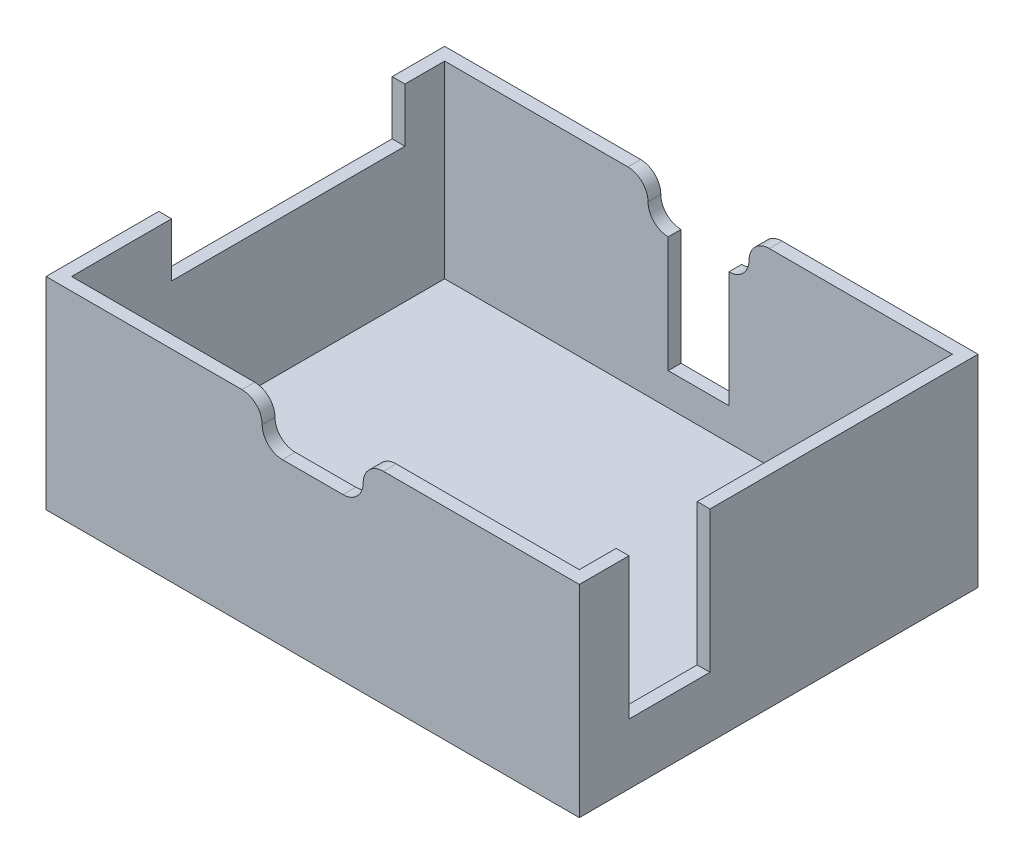
ISO-10303-21;
HEADER;
FILE_DESCRIPTION(('STEP AP214'),'2;1');
FILE_NAME('part.step','',(''),(''),'','','');
FILE_SCHEMA(('AUTOMOTIVE_DESIGN { 1 0 10303 214 1 1 1 1 }'));
ENDSEC;
DATA;
#1=APPLICATION_CONTEXT('core data for automotive mechanical design processes');
#2=APPLICATION_PROTOCOL_DEFINITION('international standard','automotive_design',2000,#1);
#3=PRODUCT_CONTEXT('',#1,'mechanical');
#4=PRODUCT('Part','Part','',(#3));
#5=PRODUCT_RELATED_PRODUCT_CATEGORY('part','',(#4));
#6=PRODUCT_DEFINITION_FORMATION('','',#4);
#7=PRODUCT_DEFINITION_CONTEXT('part definition',#1,'design');
#8=PRODUCT_DEFINITION('design','',#6,#7);
#9=PRODUCT_DEFINITION_SHAPE('','',#8);
#10=(LENGTH_UNIT() NAMED_UNIT(*) SI_UNIT(.MILLI.,.METRE.));
#11=(NAMED_UNIT(*) PLANE_ANGLE_UNIT() SI_UNIT($,.RADIAN.));
#12=(NAMED_UNIT(*) SI_UNIT($,.STERADIAN.) SOLID_ANGLE_UNIT());
#13=UNCERTAINTY_MEASURE_WITH_UNIT(LENGTH_MEASURE(1.E-05),#10,'distance_accuracy_value','');
#14=(GEOMETRIC_REPRESENTATION_CONTEXT(3) GLOBAL_UNCERTAINTY_ASSIGNED_CONTEXT((#13)) GLOBAL_UNIT_ASSIGNED_CONTEXT((#10,
#11,#12)) REPRESENTATION_CONTEXT('',''));
#15=CARTESIAN_POINT('',(0.,0.,0.));
#16=DIRECTION('',(0.,0.,1.));
#17=DIRECTION('',(1.,0.,0.));
#18=AXIS2_PLACEMENT_3D('',#15,#16,#17);
#19=CARTESIAN_POINT('',(0.,38.1,0.));
#20=DIRECTION('',(0.,1.,0.));
#21=DIRECTION('',(0.,0.,1.));
#22=AXIS2_PLACEMENT_3D('',#19,#20,#21);
#23=PLANE('',#22);
#24=DIRECTION('',(0.,0.,-1.));
#25=VECTOR('',#24,1.);
#26=CARTESIAN_POINT('',(100.584,38.1,-75.184));
#27=LINE('',#26,#25);
#28=CARTESIAN_POINT('',(100.584,38.1,0.));
#29=VERTEX_POINT('',#28);
#30=CARTESIAN_POINT('',(100.584,38.1,-9.35933554843175));
#31=VERTEX_POINT('',#30);
#32=EDGE_CURVE('E339',#29,#31,#27,.T.);
#33=ORIENTED_EDGE('',*,*,#32,.T.);
#34=DIRECTION('',(-1.,0.,0.));
#35=VECTOR('',#34,1.);
#36=CARTESIAN_POINT('',(0.,38.1,-9.35933554843175));
#37=LINE('',#36,#35);
#38=CARTESIAN_POINT('',(98.171,38.1,-9.35933554843175));
#39=VERTEX_POINT('',#38);
#40=EDGE_CURVE('E332',#31,#39,#37,.T.);
#41=ORIENTED_EDGE('',*,*,#40,.T.);
#42=DIRECTION('',(0.,0.,-1.));
#43=VECTOR('',#42,1.);
#44=CARTESIAN_POINT('',(98.171,38.1,-72.771));
#45=LINE('',#44,#43);
#46=CARTESIAN_POINT('',(98.171,38.1,-2.41299999999998));
#47=VERTEX_POINT('',#46);
#48=EDGE_CURVE('E326',#47,#39,#45,.T.);
#49=ORIENTED_EDGE('',*,*,#48,.F.);
#50=DIRECTION('',(1.,0.,0.));
#51=VECTOR('',#50,1.);
#52=CARTESIAN_POINT('',(2.41299999999998,38.1,-2.41300000000001));
#53=LINE('',#52,#51);
#54=CARTESIAN_POINT('',(63.627,38.1,-2.41299999999999));
#55=VERTEX_POINT('',#54);
#56=EDGE_CURVE('E379',#55,#47,#53,.T.);
#57=ORIENTED_EDGE('',*,*,#56,.F.);
#58=DIRECTION('',(0.,0.,-1.));
#59=VECTOR('',#58,1.);
#60=CARTESIAN_POINT('',(63.627,38.1,0.));
#61=LINE('',#60,#59);
#62=CARTESIAN_POINT('',(63.627,38.1,0.));
#63=VERTEX_POINT('',#62);
#64=EDGE_CURVE('E492',#55,#63,#61,.F.);
#65=ORIENTED_EDGE('',*,*,#64,.T.);
#66=DIRECTION('',(1.,0.,0.));
#67=VECTOR('',#66,1.);
#68=CARTESIAN_POINT('',(0.,38.1,0.));
#69=LINE('',#68,#67);
#70=EDGE_CURVE('E426',#63,#29,#69,.T.);
#71=ORIENTED_EDGE('',*,*,#70,.T.);
#72=EDGE_LOOP('',(#33,#41,#49,#57,#65,#71));
#73=FACE_BOUND('',#72,.T.);
#74=ADVANCED_FACE('F42',(#73),#23,.T.);
#75=CARTESIAN_POINT('',(100.584,2.54,0.));
#76=DIRECTION('',(-1.,0.,0.));
#77=DIRECTION('',(0.,0.,1.));
#78=AXIS2_PLACEMENT_3D('',#75,#76,#77);
#79=PLANE('',#78);
#80=DIRECTION('',(0.,1.,0.));
#81=VECTOR('',#80,1.);
#82=CARTESIAN_POINT('',(100.584,11.430254,-9.35933554843175));
#83=LINE('',#82,#81);
#84=CARTESIAN_POINT('',(100.584,11.430254,-9.35933554843175));
#85=VERTEX_POINT('',#84);
#86=EDGE_CURVE('E611',#85,#31,#83,.T.);
#87=ORIENTED_EDGE('',*,*,#86,.T.);
#88=ORIENTED_EDGE('',*,*,#32,.F.);
#89=DIRECTION('',(0.,-1.,0.));
#90=VECTOR('',#89,1.);
#91=CARTESIAN_POINT('',(100.584,2.54,0.));
#92=LINE('',#91,#90);
#93=CARTESIAN_POINT('',(100.584,0.,0.));
#94=VERTEX_POINT('',#93);
#95=EDGE_CURVE('E460',#29,#94,#92,.T.);
#96=ORIENTED_EDGE('',*,*,#95,.T.);
#97=DIRECTION('',(0.,0.,-1.));
#98=VECTOR('',#97,1.);
#99=CARTESIAN_POINT('',(100.584,0.,0.));
#100=LINE('',#99,#98);
#101=CARTESIAN_POINT('',(100.584,0.,-75.184));
#102=VERTEX_POINT('',#101);
#103=EDGE_CURVE('E446',#94,#102,#100,.T.);
#104=ORIENTED_EDGE('',*,*,#103,.T.);
#105=DIRECTION('',(0.,-1.,0.));
#106=VECTOR('',#105,1.);
#107=CARTESIAN_POINT('',(100.584,2.54,-75.184));
#108=LINE('',#107,#106);
#109=CARTESIAN_POINT('',(100.584,38.1,-75.184));
#110=VERTEX_POINT('',#109);
#111=EDGE_CURVE('E456',#110,#102,#108,.T.);
#112=ORIENTED_EDGE('',*,*,#111,.F.);
#113=CARTESIAN_POINT('',(100.584,38.1,-24.638));
#114=VERTEX_POINT('',#113);
#115=EDGE_CURVE('E431',#114,#110,#27,.T.);
#116=ORIENTED_EDGE('',*,*,#115,.F.);
#117=DIRECTION('',(0.,1.,0.));
#118=VECTOR('',#117,1.);
#119=CARTESIAN_POINT('',(100.584,11.430254,-24.638));
#120=LINE('',#119,#118);
#121=CARTESIAN_POINT('',(100.584,11.430254,-24.638));
#122=VERTEX_POINT('',#121);
#123=EDGE_CURVE('E607',#122,#114,#120,.T.);
#124=ORIENTED_EDGE('',*,*,#123,.F.);
#125=DIRECTION('',(0.,0.,1.));
#126=VECTOR('',#125,1.);
#127=CARTESIAN_POINT('',(100.584,11.430254,-24.638));
#128=LINE('',#127,#126);
#129=EDGE_CURVE('E604',#122,#85,#128,.T.);
#130=ORIENTED_EDGE('',*,*,#129,.T.);
#131=EDGE_LOOP('',(#87,#88,#96,#104,#112,#116,#124,#130));
#132=FACE_BOUND('',#131,.T.);
#133=ADVANCED_FACE('F581',(#132),#79,.F.);
#134=CARTESIAN_POINT('',(98.171,38.1,-72.771));
#135=DIRECTION('',(-1.,0.,0.));
#136=DIRECTION('',(0.,0.,1.));
#137=AXIS2_PLACEMENT_3D('',#134,#135,#136);
#138=PLANE('',#137);
#139=ORIENTED_EDGE('',*,*,#48,.T.);
#140=DIRECTION('',(0.,-1.,0.));
#141=VECTOR('',#140,1.);
#142=CARTESIAN_POINT('',(98.171,38.1,-9.35933554843175));
#143=LINE('',#142,#141);
#144=CARTESIAN_POINT('',(98.171,11.430254,-9.35933554843175));
#145=VERTEX_POINT('',#144);
#146=EDGE_CURVE('E51',#39,#145,#143,.T.);
#147=ORIENTED_EDGE('',*,*,#146,.T.);
#148=DIRECTION('',(0.,0.,-1.));
#149=VECTOR('',#148,1.);
#150=CARTESIAN_POINT('',(98.171,11.430254,-72.771));
#151=LINE('',#150,#149);
#152=CARTESIAN_POINT('',(98.171,11.430254,-24.638));
#153=VERTEX_POINT('',#152);
#154=EDGE_CURVE('E316',#145,#153,#151,.T.);
#155=ORIENTED_EDGE('',*,*,#154,.T.);
#156=DIRECTION('',(0.,-1.,0.));
#157=VECTOR('',#156,1.);
#158=CARTESIAN_POINT('',(98.171,38.1,-24.638));
#159=LINE('',#158,#157);
#160=CARTESIAN_POINT('',(98.171,38.1,-24.638));
#161=VERTEX_POINT('',#160);
#162=EDGE_CURVE('E313',#161,#153,#159,.T.);
#163=ORIENTED_EDGE('',*,*,#162,.F.);
#164=CARTESIAN_POINT('',(98.171,38.1,-72.771));
#165=VERTEX_POINT('',#164);
#166=EDGE_CURVE('E385',#161,#165,#45,.T.);
#167=ORIENTED_EDGE('',*,*,#166,.T.);
#168=DIRECTION('',(0.,-1.,0.));
#169=VECTOR('',#168,1.);
#170=CARTESIAN_POINT('',(98.171,38.1,-72.771));
#171=LINE('',#170,#169);
#172=CARTESIAN_POINT('',(98.171,2.54,-72.771));
#173=VERTEX_POINT('',#172);
#174=EDGE_CURVE('E411',#165,#173,#171,.T.);
#175=ORIENTED_EDGE('',*,*,#174,.T.);
#176=DIRECTION('',(0.,0.,-1.));
#177=VECTOR('',#176,1.);
#178=CARTESIAN_POINT('',(98.171,2.54,-72.771));
#179=LINE('',#178,#177);
#180=CARTESIAN_POINT('',(98.171,2.54,-2.41299999999998));
#181=VERTEX_POINT('',#180);
#182=EDGE_CURVE('E401',#181,#173,#179,.T.);
#183=ORIENTED_EDGE('',*,*,#182,.F.);
#184=DIRECTION('',(0.,-1.,0.));
#185=VECTOR('',#184,1.);
#186=CARTESIAN_POINT('',(98.171,38.1,-2.41299999999998));
#187=LINE('',#186,#185);
#188=EDGE_CURVE('E414',#47,#181,#187,.T.);
#189=ORIENTED_EDGE('',*,*,#188,.F.);
#190=EDGE_LOOP('',(#139,#147,#155,#163,#167,#175,#183,#189));
#191=FACE_BOUND('',#190,.T.);
#192=ADVANCED_FACE('F323',(#191),#138,.T.);
#193=CARTESIAN_POINT('',(0.,2.54,0.));
#194=DIRECTION('',(1.,0.,0.));
#195=DIRECTION('',(0.,0.,-1.));
#196=AXIS2_PLACEMENT_3D('',#193,#194,#195);
#197=PLANE('',#196);
#198=DIRECTION('',(0.,1.,0.));
#199=VECTOR('',#198,1.);
#200=CARTESIAN_POINT('',(0.,0.,-65.278));
#201=LINE('',#200,#199);
#202=CARTESIAN_POINT('',(0.,27.940254,-65.278));
#203=VERTEX_POINT('',#202);
#204=CARTESIAN_POINT('',(0.,38.1,-65.278));
#205=VERTEX_POINT('',#204);
#206=EDGE_CURVE('E353',#203,#205,#201,.T.);
#207=ORIENTED_EDGE('',*,*,#206,.T.);
#208=DIRECTION('',(0.,0.,1.));
#209=VECTOR('',#208,1.);
#210=CARTESIAN_POINT('',(0.,38.1,-75.184));
#211=LINE('',#210,#209);
#212=CARTESIAN_POINT('',(0.,38.1,-75.184));
#213=VERTEX_POINT('',#212);
#214=EDGE_CURVE('E422',#213,#205,#211,.T.);
#215=ORIENTED_EDGE('',*,*,#214,.F.);
#216=DIRECTION('',(0.,-1.,0.));
#217=VECTOR('',#216,1.);
#218=CARTESIAN_POINT('',(0.,2.54,-75.184));
#219=LINE('',#218,#217);
#220=CARTESIAN_POINT('',(0.,0.,-75.184));
#221=VERTEX_POINT('',#220);
#222=EDGE_CURVE('E452',#213,#221,#219,.T.);
#223=ORIENTED_EDGE('',*,*,#222,.T.);
#224=DIRECTION('',(0.,0.,1.));
#225=VECTOR('',#224,1.);
#226=CARTESIAN_POINT('',(0.,0.,0.));
#227=LINE('',#226,#225);
#228=CARTESIAN_POINT('',(0.,0.,0.));
#229=VERTEX_POINT('',#228);
#230=EDGE_CURVE('E439',#221,#229,#227,.T.);
#231=ORIENTED_EDGE('',*,*,#230,.T.);
#232=DIRECTION('',(0.,-1.,0.));
#233=VECTOR('',#232,1.);
#234=CARTESIAN_POINT('',(0.,2.54,0.));
#235=LINE('',#234,#233);
#236=CARTESIAN_POINT('',(0.,38.1,0.));
#237=VERTEX_POINT('',#236);
#238=EDGE_CURVE('E464',#237,#229,#235,.T.);
#239=ORIENTED_EDGE('',*,*,#238,.F.);
#240=CARTESIAN_POINT('',(0.,38.1,-21.270705039312));
#241=VERTEX_POINT('',#240);
#242=EDGE_CURVE('E421',#241,#237,#211,.T.);
#243=ORIENTED_EDGE('',*,*,#242,.F.);
#244=DIRECTION('',(0.,1.,0.));
#245=VECTOR('',#244,1.);
#246=CARTESIAN_POINT('',(0.,0.,-21.270705039312));
#247=LINE('',#246,#245);
#248=CARTESIAN_POINT('',(0.,27.940254,-21.270705039312));
#249=VERTEX_POINT('',#248);
#250=EDGE_CURVE('E346',#249,#241,#247,.T.);
#251=ORIENTED_EDGE('',*,*,#250,.F.);
#252=DIRECTION('',(0.,0.,1.));
#253=VECTOR('',#252,1.);
#254=CARTESIAN_POINT('',(0.,27.940254,0.));
#255=LINE('',#254,#253);
#256=EDGE_CURVE('E341',#203,#249,#255,.T.);
#257=ORIENTED_EDGE('',*,*,#256,.F.);
#258=EDGE_LOOP('',(#207,#215,#223,#231,#239,#243,#251,#257));
#259=FACE_BOUND('',#258,.T.);
#260=ADVANCED_FACE('F572',(#259),#197,.F.);
#261=ORIENTED_EDGE('',*,*,#214,.T.);
#262=DIRECTION('',(-1.,0.,0.));
#263=VECTOR('',#262,1.);
#264=CARTESIAN_POINT('',(6.35,38.1,-65.278));
#265=LINE('',#264,#263);
#266=CARTESIAN_POINT('',(2.41299999999999,38.1,-65.278));
#267=VERTEX_POINT('',#266);
#268=EDGE_CURVE('E360',#267,#205,#265,.T.);
#269=ORIENTED_EDGE('',*,*,#268,.F.);
#270=DIRECTION('',(0.,0.,1.));
#271=VECTOR('',#270,1.);
#272=CARTESIAN_POINT('',(2.413,38.1,-72.771));
#273=LINE('',#272,#271);
#274=CARTESIAN_POINT('',(2.413,38.1,-72.771));
#275=VERTEX_POINT('',#274);
#276=EDGE_CURVE('E375',#275,#267,#273,.T.);
#277=ORIENTED_EDGE('',*,*,#276,.F.);
#278=DIRECTION('',(-1.,0.,0.));
#279=VECTOR('',#278,1.);
#280=CARTESIAN_POINT('',(2.413,38.1,-72.771));
#281=LINE('',#280,#279);
#282=CARTESIAN_POINT('',(36.957,38.1,-72.771));
#283=VERTEX_POINT('',#282);
#284=EDGE_CURVE('E388',#283,#275,#281,.T.);
#285=ORIENTED_EDGE('',*,*,#284,.F.);
#286=DIRECTION('',(0.,0.,-1.));
#287=VECTOR('',#286,1.);
#288=CARTESIAN_POINT('',(36.957,38.1,-75.184));
#289=LINE('',#288,#287);
#290=CARTESIAN_POINT('',(36.957,38.1,-75.184));
#291=VERTEX_POINT('',#290);
#292=EDGE_CURVE('E468',#283,#291,#289,.T.);
#293=ORIENTED_EDGE('',*,*,#292,.T.);
#294=DIRECTION('',(-1.,0.,0.));
#295=VECTOR('',#294,1.);
#296=CARTESIAN_POINT('',(0.,38.1,-75.184));
#297=LINE('',#296,#295);
#298=EDGE_CURVE('E434',#291,#213,#297,.T.);
#299=ORIENTED_EDGE('',*,*,#298,.T.);
#300=EDGE_LOOP('',(#261,#269,#277,#285,#293,#299));
#301=FACE_BOUND('',#300,.T.);
#302=ADVANCED_FACE('F656',(#301),#23,.T.);
#303=CARTESIAN_POINT('',(2.413,38.1,-72.771));
#304=DIRECTION('',(1.,0.,0.));
#305=DIRECTION('',(0.,0.,-1.));
#306=AXIS2_PLACEMENT_3D('',#303,#304,#305);
#307=PLANE('',#306);
#308=ORIENTED_EDGE('',*,*,#276,.T.);
#309=DIRECTION('',(0.,-1.,0.));
#310=VECTOR('',#309,1.);
#311=CARTESIAN_POINT('',(2.41299999999999,38.1,-65.278));
#312=LINE('',#311,#310);
#313=CARTESIAN_POINT('',(2.41299999999999,27.940254,-65.278));
#314=VERTEX_POINT('',#313);
#315=EDGE_CURVE('E309',#267,#314,#312,.T.);
#316=ORIENTED_EDGE('',*,*,#315,.T.);
#317=DIRECTION('',(0.,0.,-1.));
#318=VECTOR('',#317,1.);
#319=CARTESIAN_POINT('',(2.413,27.940254,-72.771));
#320=LINE('',#319,#318);
#321=CARTESIAN_POINT('',(2.41299999999999,27.940254,-21.270705039312));
#322=VERTEX_POINT('',#321);
#323=EDGE_CURVE('E306',#322,#314,#320,.T.);
#324=ORIENTED_EDGE('',*,*,#323,.F.);
#325=DIRECTION('',(0.,-1.,0.));
#326=VECTOR('',#325,1.);
#327=CARTESIAN_POINT('',(2.41299999999999,38.1,-21.270705039312));
#328=LINE('',#327,#326);
#329=CARTESIAN_POINT('',(2.41299999999999,38.1,-21.270705039312));
#330=VERTEX_POINT('',#329);
#331=EDGE_CURVE('E287',#330,#322,#328,.T.);
#332=ORIENTED_EDGE('',*,*,#331,.F.);
#333=CARTESIAN_POINT('',(2.41299999999998,38.1,-2.41300000000001));
#334=VERTEX_POINT('',#333);
#335=EDGE_CURVE('E380',#330,#334,#273,.T.);
#336=ORIENTED_EDGE('',*,*,#335,.T.);
#337=DIRECTION('',(0.,-1.,0.));
#338=VECTOR('',#337,1.);
#339=CARTESIAN_POINT('',(2.41299999999998,38.1,-2.41300000000001));
#340=LINE('',#339,#338);
#341=CARTESIAN_POINT('',(2.41299999999998,2.54,-2.41300000000001));
#342=VERTEX_POINT('',#341);
#343=EDGE_CURVE('E417',#334,#342,#340,.T.);
#344=ORIENTED_EDGE('',*,*,#343,.T.);
#345=DIRECTION('',(0.,0.,1.));
#346=VECTOR('',#345,1.);
#347=CARTESIAN_POINT('',(2.413,2.54,-72.771));
#348=LINE('',#347,#346);
#349=CARTESIAN_POINT('',(2.413,2.54,-72.771));
#350=VERTEX_POINT('',#349);
#351=EDGE_CURVE('E374',#350,#342,#348,.T.);
#352=ORIENTED_EDGE('',*,*,#351,.F.);
#353=DIRECTION('',(0.,-1.,0.));
#354=VECTOR('',#353,1.);
#355=CARTESIAN_POINT('',(2.413,38.1,-72.771));
#356=LINE('',#355,#354);
#357=EDGE_CURVE('E393',#275,#350,#356,.T.);
#358=ORIENTED_EDGE('',*,*,#357,.F.);
#359=EDGE_LOOP('',(#308,#316,#324,#332,#336,#344,#352,#358));
#360=FACE_BOUND('',#359,.T.);
#361=ADVANCED_FACE('F548',(#360),#307,.T.);
#362=DIRECTION('',(-1.,0.,0.));
#363=VECTOR('',#362,1.);
#364=CARTESIAN_POINT('',(0.,38.1,-24.638));
#365=LINE('',#364,#363);
#366=EDGE_CURVE('E58',#114,#161,#365,.T.);
#367=ORIENTED_EDGE('',*,*,#366,.F.);
#368=ORIENTED_EDGE('',*,*,#115,.T.);
#369=CARTESIAN_POINT('',(63.627,38.1,-75.184));
#370=VERTEX_POINT('',#369);
#371=EDGE_CURVE('E435',#110,#370,#297,.T.);
#372=ORIENTED_EDGE('',*,*,#371,.T.);
#373=DIRECTION('',(0.,0.,-1.));
#374=VECTOR('',#373,1.);
#375=CARTESIAN_POINT('',(63.627,38.1,-72.771));
#376=LINE('',#375,#374);
#377=CARTESIAN_POINT('',(63.627,38.1,-72.771));
#378=VERTEX_POINT('',#377);
#379=EDGE_CURVE('E488',#370,#378,#376,.F.);
#380=ORIENTED_EDGE('',*,*,#379,.T.);
#381=EDGE_CURVE('E389',#165,#378,#281,.T.);
#382=ORIENTED_EDGE('',*,*,#381,.F.);
#383=ORIENTED_EDGE('',*,*,#166,.F.);
#384=EDGE_LOOP('',(#367,#368,#372,#380,#382,#383));
#385=FACE_BOUND('',#384,.T.);
#386=ADVANCED_FACE('F586',(#385),#23,.T.);
#387=CARTESIAN_POINT('',(0.,2.54,0.));
#388=DIRECTION('',(0.,0.,-1.));
#389=DIRECTION('',(-1.,0.,0.));
#390=AXIS2_PLACEMENT_3D('',#387,#388,#389);
#391=PLANE('',#390);
#392=DIRECTION('',(-1.,0.,0.));
#393=VECTOR('',#392,1.);
#394=CARTESIAN_POINT('',(59.817,30.48,0.));
#395=LINE('',#394,#393);
#396=CARTESIAN_POINT('',(56.007,30.48,0.));
#397=VERTEX_POINT('',#396);
#398=CARTESIAN_POINT('',(44.577,30.48,0.));
#399=VERTEX_POINT('',#398);
#400=EDGE_CURVE('E292',#397,#399,#395,.T.);
#401=ORIENTED_EDGE('',*,*,#400,.T.);
#402=CARTESIAN_POINT('',(44.577,34.29,0.));
#403=DIRECTION('',(0.,0.,-1.));
#404=DIRECTION('',(-1.,0.,0.));
#405=AXIS2_PLACEMENT_3D('',#402,#403,#404);
#406=CIRCLE('',#405,3.81);
#407=CARTESIAN_POINT('',(40.767,34.29,0.));
#408=VERTEX_POINT('',#407);
#409=EDGE_CURVE('E518',#399,#408,#406,.T.);
#410=ORIENTED_EDGE('',*,*,#409,.T.);
#411=CARTESIAN_POINT('',(36.957,34.29,0.));
#412=DIRECTION('',(0.,0.,-1.));
#413=DIRECTION('',(-1.,0.,0.));
#414=AXIS2_PLACEMENT_3D('',#411,#412,#413);
#415=CIRCLE('',#414,3.81);
#416=CARTESIAN_POINT('',(36.957,38.1,0.));
#417=VERTEX_POINT('',#416);
#418=EDGE_CURVE('E485',#408,#417,#415,.F.);
#419=ORIENTED_EDGE('',*,*,#418,.T.);
#420=EDGE_CURVE('E427',#237,#417,#69,.T.);
#421=ORIENTED_EDGE('',*,*,#420,.F.);
#422=ORIENTED_EDGE('',*,*,#238,.T.);
#423=DIRECTION('',(1.,0.,0.));
#424=VECTOR('',#423,1.);
#425=CARTESIAN_POINT('',(0.,0.,0.));
#426=LINE('',#425,#424);
#427=EDGE_CURVE('E443',#229,#94,#426,.T.);
#428=ORIENTED_EDGE('',*,*,#427,.T.);
#429=ORIENTED_EDGE('',*,*,#95,.F.);
#430=ORIENTED_EDGE('',*,*,#70,.F.);
#431=CARTESIAN_POINT('',(63.627,34.29,0.));
#432=DIRECTION('',(0.,0.,-1.));
#433=DIRECTION('',(-1.,0.,0.));
#434=AXIS2_PLACEMENT_3D('',#431,#432,#433);
#435=CIRCLE('',#434,3.81);
#436=CARTESIAN_POINT('',(59.817,34.29,0.));
#437=VERTEX_POINT('',#436);
#438=EDGE_CURVE('E482',#63,#437,#435,.F.);
#439=ORIENTED_EDGE('',*,*,#438,.T.);
#440=CARTESIAN_POINT('',(56.007,34.29,0.));
#441=DIRECTION('',(0.,0.,-1.));
#442=DIRECTION('',(-1.,0.,0.));
#443=AXIS2_PLACEMENT_3D('',#440,#441,#442);
#444=CIRCLE('',#443,3.81);
#445=EDGE_CURVE('E272',#437,#397,#444,.T.);
#446=ORIENTED_EDGE('',*,*,#445,.T.);
#447=EDGE_LOOP('',(#401,#410,#419,#421,#422,#428,#429,#430,#439,#446));
#448=FACE_BOUND('',#447,.T.);
#449=ADVANCED_FACE('F537',(#448),#391,.F.);
#450=CARTESIAN_POINT('',(0.,2.54,-75.184));
#451=DIRECTION('',(0.,0.,1.));
#452=DIRECTION('',(1.,0.,0.));
#453=AXIS2_PLACEMENT_3D('',#450,#451,#452);
#454=PLANE('',#453);
#455=CARTESIAN_POINT('',(44.577,34.29,-75.184));
#456=DIRECTION('',(0.,0.,1.));
#457=DIRECTION('',(1.,0.,0.));
#458=AXIS2_PLACEMENT_3D('',#455,#456,#457);
#459=CIRCLE('',#458,3.81);
#460=CARTESIAN_POINT('',(40.767,34.29,-75.184));
#461=VERTEX_POINT('',#460);
#462=CARTESIAN_POINT('',(44.577,30.48,-75.184));
#463=VERTEX_POINT('',#462);
#464=EDGE_CURVE('E276',#461,#463,#459,.T.);
#465=ORIENTED_EDGE('',*,*,#464,.T.);
#466=DIRECTION('',(0.,1.,0.));
#467=VECTOR('',#466,1.);
#468=CARTESIAN_POINT('',(44.577,30.48,-75.184));
#469=LINE('',#468,#467);
#470=CARTESIAN_POINT('',(44.577,8.62091747437512,-75.184));
#471=VERTEX_POINT('',#470);
#472=EDGE_CURVE('E264',#471,#463,#469,.T.);
#473=ORIENTED_EDGE('',*,*,#472,.F.);
#474=DIRECTION('',(-1.,0.,0.));
#475=VECTOR('',#474,1.);
#476=CARTESIAN_POINT('',(44.577,8.62091747437512,-75.184));
#477=LINE('',#476,#475);
#478=CARTESIAN_POINT('',(56.007,8.62091747437512,-75.184));
#479=VERTEX_POINT('',#478);
#480=EDGE_CURVE('E262',#479,#471,#477,.T.);
#481=ORIENTED_EDGE('',*,*,#480,.F.);
#482=DIRECTION('',(0.,-1.,0.));
#483=VECTOR('',#482,1.);
#484=CARTESIAN_POINT('',(56.007,30.48,-75.184));
#485=LINE('',#484,#483);
#486=CARTESIAN_POINT('',(56.007,30.48,-75.184));
#487=VERTEX_POINT('',#486);
#488=EDGE_CURVE('E243',#487,#479,#485,.T.);
#489=ORIENTED_EDGE('',*,*,#488,.F.);
#490=CARTESIAN_POINT('',(56.007,34.29,-75.184));
#491=DIRECTION('',(0.,0.,1.));
#492=DIRECTION('',(1.,0.,0.));
#493=AXIS2_PLACEMENT_3D('',#490,#491,#492);
#494=CIRCLE('',#493,3.81);
#495=CARTESIAN_POINT('',(59.817,34.29,-75.184));
#496=VERTEX_POINT('',#495);
#497=EDGE_CURVE('E258',#487,#496,#494,.T.);
#498=ORIENTED_EDGE('',*,*,#497,.T.);
#499=CARTESIAN_POINT('',(63.627,34.29,-75.184));
#500=DIRECTION('',(0.,0.,1.));
#501=DIRECTION('',(1.,0.,0.));
#502=AXIS2_PLACEMENT_3D('',#499,#500,#501);
#503=CIRCLE('',#502,3.81);
#504=EDGE_CURVE('E499',#496,#370,#503,.F.);
#505=ORIENTED_EDGE('',*,*,#504,.T.);
#506=ORIENTED_EDGE('',*,*,#371,.F.);
#507=ORIENTED_EDGE('',*,*,#111,.T.);
#508=DIRECTION('',(-1.,0.,0.));
#509=VECTOR('',#508,1.);
#510=CARTESIAN_POINT('',(0.,0.,-75.184));
#511=LINE('',#510,#509);
#512=EDGE_CURVE('E449',#102,#221,#511,.T.);
#513=ORIENTED_EDGE('',*,*,#512,.T.);
#514=ORIENTED_EDGE('',*,*,#222,.F.);
#515=ORIENTED_EDGE('',*,*,#298,.F.);
#516=CARTESIAN_POINT('',(36.957,34.29,-75.184));
#517=DIRECTION('',(0.,0.,1.));
#518=DIRECTION('',(1.,0.,0.));
#519=AXIS2_PLACEMENT_3D('',#516,#517,#518);
#520=CIRCLE('',#519,3.81);
#521=EDGE_CURVE('E496',#291,#461,#520,.F.);
#522=ORIENTED_EDGE('',*,*,#521,.T.);
#523=EDGE_LOOP('',(#465,#473,#481,#489,#498,#505,#506,#507,#513,#514,#515,#522));
#524=FACE_BOUND('',#523,.T.);
#525=ADVANCED_FACE('F257',(#524),#454,.F.);
#526=CARTESIAN_POINT('',(0.,0.,0.));
#527=DIRECTION('',(0.,-1.,0.));
#528=DIRECTION('',(0.,0.,-1.));
#529=AXIS2_PLACEMENT_3D('',#526,#527,#528);
#530=PLANE('',#529);
#531=ORIENTED_EDGE('',*,*,#230,.F.);
#532=ORIENTED_EDGE('',*,*,#512,.F.);
#533=ORIENTED_EDGE('',*,*,#103,.F.);
#534=ORIENTED_EDGE('',*,*,#427,.F.);
#535=EDGE_LOOP('',(#531,#532,#533,#534));
#536=FACE_BOUND('',#535,.T.);
#537=ADVANCED_FACE('F577',(#536),#530,.T.);
#538=DIRECTION('',(-1.,0.,0.));
#539=VECTOR('',#538,1.);
#540=CARTESIAN_POINT('',(6.35,38.1,-21.270705039312));
#541=LINE('',#540,#539);
#542=EDGE_CURVE('E66',#330,#241,#541,.T.);
#543=ORIENTED_EDGE('',*,*,#542,.T.);
#544=ORIENTED_EDGE('',*,*,#242,.T.);
#545=ORIENTED_EDGE('',*,*,#420,.T.);
#546=DIRECTION('',(0.,0.,-1.));
#547=VECTOR('',#546,1.);
#548=CARTESIAN_POINT('',(36.957,38.1,-2.413));
#549=LINE('',#548,#547);
#550=CARTESIAN_POINT('',(36.957,38.1,-2.413));
#551=VERTEX_POINT('',#550);
#552=EDGE_CURVE('E472',#417,#551,#549,.T.);
#553=ORIENTED_EDGE('',*,*,#552,.T.);
#554=EDGE_CURVE('E381',#334,#551,#53,.T.);
#555=ORIENTED_EDGE('',*,*,#554,.F.);
#556=ORIENTED_EDGE('',*,*,#335,.F.);
#557=EDGE_LOOP('',(#543,#544,#545,#553,#555,#556));
#558=FACE_BOUND('',#557,.T.);
#559=ADVANCED_FACE('F553',(#558),#23,.T.);
#560=CARTESIAN_POINT('',(2.41299999999998,38.1,-2.41300000000001));
#561=DIRECTION('',(0.,0.,-1.));
#562=DIRECTION('',(-1.,0.,0.));
#563=AXIS2_PLACEMENT_3D('',#560,#561,#562);
#564=PLANE('',#563);
#565=ORIENTED_EDGE('',*,*,#554,.T.);
#566=CARTESIAN_POINT('',(36.957,34.29,-2.413));
#567=DIRECTION('',(0.,0.,-1.));
#568=DIRECTION('',(-1.,0.,0.));
#569=AXIS2_PLACEMENT_3D('',#566,#567,#568);
#570=CIRCLE('',#569,3.81);
#571=CARTESIAN_POINT('',(40.767,34.29,-2.413));
#572=VERTEX_POINT('',#571);
#573=EDGE_CURVE('E479',#551,#572,#570,.T.);
#574=ORIENTED_EDGE('',*,*,#573,.T.);
#575=CARTESIAN_POINT('',(44.577,34.29,-2.413));
#576=DIRECTION('',(0.,0.,-1.));
#577=DIRECTION('',(-1.,0.,0.));
#578=AXIS2_PLACEMENT_3D('',#575,#576,#577);
#579=CIRCLE('',#578,3.81);
#580=CARTESIAN_POINT('',(44.577,30.48,-2.413));
#581=VERTEX_POINT('',#580);
#582=EDGE_CURVE('E252',#572,#581,#579,.F.);
#583=ORIENTED_EDGE('',*,*,#582,.T.);
#584=DIRECTION('',(-1.,0.,0.));
#585=VECTOR('',#584,1.);
#586=CARTESIAN_POINT('',(2.41299999999998,30.48,-2.41300000000001));
#587=LINE('',#586,#585);
#588=CARTESIAN_POINT('',(56.007,30.48,-2.41299999999999));
#589=VERTEX_POINT('',#588);
#590=EDGE_CURVE('E370',#589,#581,#587,.T.);
#591=ORIENTED_EDGE('',*,*,#590,.F.);
#592=CARTESIAN_POINT('',(56.007,34.29,-2.41299999999999));
#593=DIRECTION('',(0.,0.,-1.));
#594=DIRECTION('',(-1.,0.,0.));
#595=AXIS2_PLACEMENT_3D('',#592,#593,#594);
#596=CIRCLE('',#595,3.81);
#597=CARTESIAN_POINT('',(59.817,34.29,-2.41299999999999));
#598=VERTEX_POINT('',#597);
#599=EDGE_CURVE('E278',#589,#598,#596,.F.);
#600=ORIENTED_EDGE('',*,*,#599,.T.);
#601=CARTESIAN_POINT('',(63.627,34.29,-2.41299999999999));
#602=DIRECTION('',(0.,0.,-1.));
#603=DIRECTION('',(-1.,0.,0.));
#604=AXIS2_PLACEMENT_3D('',#601,#602,#603);
#605=CIRCLE('',#604,3.81);
#606=EDGE_CURVE('E476',#598,#55,#605,.T.);
#607=ORIENTED_EDGE('',*,*,#606,.T.);
#608=ORIENTED_EDGE('',*,*,#56,.T.);
#609=ORIENTED_EDGE('',*,*,#188,.T.);
#610=DIRECTION('',(1.,0.,0.));
#611=VECTOR('',#610,1.);
#612=CARTESIAN_POINT('',(2.41299999999998,2.54,-2.41300000000001));
#613=LINE('',#612,#611);
#614=EDGE_CURVE('E397',#342,#181,#613,.T.);
#615=ORIENTED_EDGE('',*,*,#614,.F.);
#616=ORIENTED_EDGE('',*,*,#343,.F.);
#617=EDGE_LOOP('',(#565,#574,#583,#591,#600,#607,#608,#609,#615,#616));
#618=FACE_BOUND('',#617,.T.);
#619=ADVANCED_FACE('F525',(#618),#564,.T.);
#620=CARTESIAN_POINT('',(2.413,38.1,-72.771));
#621=DIRECTION('',(0.,0.,1.));
#622=DIRECTION('',(1.,0.,0.));
#623=AXIS2_PLACEMENT_3D('',#620,#621,#622);
#624=PLANE('',#623);
#625=DIRECTION('',(0.,-1.,0.));
#626=VECTOR('',#625,1.);
#627=CARTESIAN_POINT('',(44.577,38.1,-72.771));
#628=LINE('',#627,#626);
#629=CARTESIAN_POINT('',(44.577,30.48,-72.771));
#630=VERTEX_POINT('',#629);
#631=CARTESIAN_POINT('',(44.577,8.62091747437512,-72.771));
#632=VERTEX_POINT('',#631);
#633=EDGE_CURVE('E620',#630,#632,#628,.T.);
#634=ORIENTED_EDGE('',*,*,#633,.F.);
#635=CARTESIAN_POINT('',(44.577,34.29,-72.771));
#636=DIRECTION('',(0.,0.,1.));
#637=DIRECTION('',(1.,0.,0.));
#638=AXIS2_PLACEMENT_3D('',#635,#636,#637);
#639=CIRCLE('',#638,3.81);
#640=CARTESIAN_POINT('',(40.767,34.29,-72.771));
#641=VERTEX_POINT('',#640);
#642=EDGE_CURVE('E284',#630,#641,#639,.F.);
#643=ORIENTED_EDGE('',*,*,#642,.T.);
#644=CARTESIAN_POINT('',(36.957,34.29,-72.771));
#645=DIRECTION('',(0.,0.,1.));
#646=DIRECTION('',(1.,0.,0.));
#647=AXIS2_PLACEMENT_3D('',#644,#645,#646);
#648=CIRCLE('',#647,3.81);
#649=EDGE_CURVE('E502',#641,#283,#648,.T.);
#650=ORIENTED_EDGE('',*,*,#649,.T.);
#651=ORIENTED_EDGE('',*,*,#284,.T.);
#652=ORIENTED_EDGE('',*,*,#357,.T.);
#653=DIRECTION('',(-1.,0.,0.));
#654=VECTOR('',#653,1.);
#655=CARTESIAN_POINT('',(2.413,2.54,-72.771));
#656=LINE('',#655,#654);
#657=EDGE_CURVE('E405',#173,#350,#656,.T.);
#658=ORIENTED_EDGE('',*,*,#657,.F.);
#659=ORIENTED_EDGE('',*,*,#174,.F.);
#660=ORIENTED_EDGE('',*,*,#381,.T.);
#661=CARTESIAN_POINT('',(63.627,34.29,-72.771));
#662=DIRECTION('',(0.,0.,1.));
#663=DIRECTION('',(1.,0.,0.));
#664=AXIS2_PLACEMENT_3D('',#661,#662,#663);
#665=CIRCLE('',#664,3.81);
#666=CARTESIAN_POINT('',(59.817,34.29,-72.771));
#667=VERTEX_POINT('',#666);
#668=EDGE_CURVE('E505',#378,#667,#665,.T.);
#669=ORIENTED_EDGE('',*,*,#668,.T.);
#670=CARTESIAN_POINT('',(56.007,34.29,-72.771));
#671=DIRECTION('',(0.,0.,1.));
#672=DIRECTION('',(1.,0.,0.));
#673=AXIS2_PLACEMENT_3D('',#670,#671,#672);
#674=CIRCLE('',#673,3.81);
#675=CARTESIAN_POINT('',(56.007,30.48,-72.771));
#676=VERTEX_POINT('',#675);
#677=EDGE_CURVE('E271',#667,#676,#674,.F.);
#678=ORIENTED_EDGE('',*,*,#677,.T.);
#679=DIRECTION('',(0.,1.,0.));
#680=VECTOR('',#679,1.);
#681=CARTESIAN_POINT('',(56.007,38.1,-72.771));
#682=LINE('',#681,#680);
#683=CARTESIAN_POINT('',(56.007,8.62091747437512,-72.771));
#684=VERTEX_POINT('',#683);
#685=EDGE_CURVE('E246',#684,#676,#682,.T.);
#686=ORIENTED_EDGE('',*,*,#685,.F.);
#687=DIRECTION('',(1.,0.,0.));
#688=VECTOR('',#687,1.);
#689=CARTESIAN_POINT('',(2.413,8.62091747437511,-72.771));
#690=LINE('',#689,#688);
#691=EDGE_CURVE('E11',#632,#684,#690,.T.);
#692=ORIENTED_EDGE('',*,*,#691,.F.);
#693=EDGE_LOOP('',(#634,#643,#650,#651,#652,#658,#659,#660,#669,#678,#686,#692));
#694=FACE_BOUND('',#693,.T.);
#695=ADVANCED_FACE('F592',(#694),#624,.T.);
#696=CARTESIAN_POINT('',(0.,2.54,0.));
#697=DIRECTION('',(0.,-1.,0.));
#698=DIRECTION('',(0.,0.,-1.));
#699=AXIS2_PLACEMENT_3D('',#696,#697,#698);
#700=PLANE('',#699);
#701=ORIENTED_EDGE('',*,*,#657,.T.);
#702=ORIENTED_EDGE('',*,*,#351,.T.);
#703=ORIENTED_EDGE('',*,*,#614,.T.);
#704=ORIENTED_EDGE('',*,*,#182,.T.);
#705=EDGE_LOOP('',(#701,#702,#703,#704));
#706=FACE_BOUND('',#705,.T.);
#707=ADVANCED_FACE('F688',(#706),#700,.F.);
#708=CARTESIAN_POINT('',(59.817,30.48,0.));
#709=DIRECTION('',(0.,-1.,0.));
#710=DIRECTION('',(0.,0.,-1.));
#711=AXIS2_PLACEMENT_3D('',#708,#709,#710);
#712=PLANE('',#711);
#713=ORIENTED_EDGE('',*,*,#590,.T.);
#714=DIRECTION('',(0.,0.,-1.));
#715=VECTOR('',#714,1.);
#716=CARTESIAN_POINT('',(44.577,30.48,0.));
#717=LINE('',#716,#715);
#718=EDGE_CURVE('E511',#581,#399,#717,.F.);
#719=ORIENTED_EDGE('',*,*,#718,.T.);
#720=ORIENTED_EDGE('',*,*,#400,.F.);
#721=DIRECTION('',(0.,0.,-1.));
#722=VECTOR('',#721,1.);
#723=CARTESIAN_POINT('',(56.007,30.48,-2.41299999999999));
#724=LINE('',#723,#722);
#725=EDGE_CURVE('E508',#397,#589,#724,.T.);
#726=ORIENTED_EDGE('',*,*,#725,.T.);
#727=EDGE_LOOP('',(#713,#719,#720,#726));
#728=FACE_BOUND('',#727,.T.);
#729=ADVANCED_FACE('F567',(#728),#712,.F.);
#730=CARTESIAN_POINT('',(44.577,34.29,0.));
#731=DIRECTION('',(0.,0.,1.));
#732=DIRECTION('',(1.,0.,0.));
#733=AXIS2_PLACEMENT_3D('',#730,#731,#732);
#734=CYLINDRICAL_SURFACE('',#733,3.81);
#735=DIRECTION('',(0.,0.,-1.));
#736=VECTOR('',#735,1.);
#737=CARTESIAN_POINT('',(40.767,34.29,-2.413));
#738=LINE('',#737,#736);
#739=EDGE_CURVE('E288',#408,#572,#738,.T.);
#740=ORIENTED_EDGE('',*,*,#739,.F.);
#741=ORIENTED_EDGE('',*,*,#409,.F.);
#742=ORIENTED_EDGE('',*,*,#718,.F.);
#743=ORIENTED_EDGE('',*,*,#582,.F.);
#744=EDGE_LOOP('',(#740,#741,#742,#743));
#745=FACE_BOUND('',#744,.T.);
#746=ADVANCED_FACE('F563',(#745),#734,.F.);
#747=CARTESIAN_POINT('',(36.957,34.29,0.));
#748=DIRECTION('',(0.,0.,1.));
#749=DIRECTION('',(1.,0.,0.));
#750=AXIS2_PLACEMENT_3D('',#747,#748,#749);
#751=CYLINDRICAL_SURFACE('',#750,3.81);
#752=ORIENTED_EDGE('',*,*,#418,.F.);
#753=ORIENTED_EDGE('',*,*,#739,.T.);
#754=ORIENTED_EDGE('',*,*,#573,.F.);
#755=ORIENTED_EDGE('',*,*,#552,.F.);
#756=EDGE_LOOP('',(#752,#753,#754,#755));
#757=FACE_BOUND('',#756,.T.);
#758=ADVANCED_FACE('F558',(#757),#751,.T.);
#759=CARTESIAN_POINT('',(56.007,34.29,0.));
#760=DIRECTION('',(0.,0.,1.));
#761=DIRECTION('',(1.,0.,0.));
#762=AXIS2_PLACEMENT_3D('',#759,#760,#761);
#763=CYLINDRICAL_SURFACE('',#762,3.81);
#764=ORIENTED_EDGE('',*,*,#725,.F.);
#765=ORIENTED_EDGE('',*,*,#445,.F.);
#766=DIRECTION('',(0.,0.,-1.));
#767=VECTOR('',#766,1.);
#768=CARTESIAN_POINT('',(59.817,34.29,0.));
#769=LINE('',#768,#767);
#770=EDGE_CURVE('E293',#598,#437,#769,.F.);
#771=ORIENTED_EDGE('',*,*,#770,.F.);
#772=ORIENTED_EDGE('',*,*,#599,.F.);
#773=EDGE_LOOP('',(#764,#765,#771,#772));
#774=FACE_BOUND('',#773,.T.);
#775=ADVANCED_FACE('F530',(#774),#763,.F.);
#776=CARTESIAN_POINT('',(63.627,34.29,0.));
#777=DIRECTION('',(0.,0.,1.));
#778=DIRECTION('',(1.,0.,0.));
#779=AXIS2_PLACEMENT_3D('',#776,#777,#778);
#780=CYLINDRICAL_SURFACE('',#779,3.81);
#781=ORIENTED_EDGE('',*,*,#438,.F.);
#782=ORIENTED_EDGE('',*,*,#64,.F.);
#783=ORIENTED_EDGE('',*,*,#606,.F.);
#784=ORIENTED_EDGE('',*,*,#770,.T.);
#785=EDGE_LOOP('',(#781,#782,#783,#784));
#786=FACE_BOUND('',#785,.T.);
#787=ADVANCED_FACE('F533',(#786),#780,.T.);
#788=CARTESIAN_POINT('',(56.007,34.29,0.));
#789=DIRECTION('',(0.,0.,1.));
#790=DIRECTION('',(1.,0.,0.));
#791=AXIS2_PLACEMENT_3D('',#788,#789,#790);
#792=CYLINDRICAL_SURFACE('',#791,3.81);
#793=DIRECTION('',(0.,0.,-1.));
#794=VECTOR('',#793,1.);
#795=CARTESIAN_POINT('',(56.007,30.48,-75.184));
#796=LINE('',#795,#794);
#797=EDGE_CURVE('E239',#676,#487,#796,.T.);
#798=ORIENTED_EDGE('',*,*,#797,.F.);
#799=ORIENTED_EDGE('',*,*,#677,.F.);
#800=DIRECTION('',(0.,0.,-1.));
#801=VECTOR('',#800,1.);
#802=CARTESIAN_POINT('',(59.817,34.29,-72.771));
#803=LINE('',#802,#801);
#804=EDGE_CURVE('E268',#496,#667,#803,.F.);
#805=ORIENTED_EDGE('',*,*,#804,.F.);
#806=ORIENTED_EDGE('',*,*,#497,.F.);
#807=EDGE_LOOP('',(#798,#799,#805,#806));
#808=FACE_BOUND('',#807,.T.);
#809=ADVANCED_FACE('F266',(#808),#792,.F.);
#810=CARTESIAN_POINT('',(63.627,34.29,0.));
#811=DIRECTION('',(0.,0.,1.));
#812=DIRECTION('',(1.,0.,0.));
#813=AXIS2_PLACEMENT_3D('',#810,#811,#812);
#814=CYLINDRICAL_SURFACE('',#813,3.81);
#815=ORIENTED_EDGE('',*,*,#668,.F.);
#816=ORIENTED_EDGE('',*,*,#379,.F.);
#817=ORIENTED_EDGE('',*,*,#504,.F.);
#818=ORIENTED_EDGE('',*,*,#804,.T.);
#819=EDGE_LOOP('',(#815,#816,#817,#818));
#820=FACE_BOUND('',#819,.T.);
#821=ADVANCED_FACE('F589',(#820),#814,.T.);
#822=CARTESIAN_POINT('',(44.577,34.29,0.));
#823=DIRECTION('',(0.,0.,1.));
#824=DIRECTION('',(1.,0.,0.));
#825=AXIS2_PLACEMENT_3D('',#822,#823,#824);
#826=CYLINDRICAL_SURFACE('',#825,3.81);
#827=DIRECTION('',(0.,0.,-1.));
#828=VECTOR('',#827,1.);
#829=CARTESIAN_POINT('',(40.767,34.29,-75.184));
#830=LINE('',#829,#828);
#831=EDGE_CURVE('E299',#641,#461,#830,.T.);
#832=ORIENTED_EDGE('',*,*,#831,.F.);
#833=ORIENTED_EDGE('',*,*,#642,.F.);
#834=DIRECTION('',(0.,0.,-1.));
#835=VECTOR('',#834,1.);
#836=CARTESIAN_POINT('',(44.577,30.48,-72.771));
#837=LINE('',#836,#835);
#838=EDGE_CURVE('E253',#463,#630,#837,.F.);
#839=ORIENTED_EDGE('',*,*,#838,.F.);
#840=ORIENTED_EDGE('',*,*,#464,.F.);
#841=EDGE_LOOP('',(#832,#833,#839,#840));
#842=FACE_BOUND('',#841,.T.);
#843=ADVANCED_FACE('F44',(#842),#826,.F.);
#844=CARTESIAN_POINT('',(36.957,34.29,0.));
#845=DIRECTION('',(0.,0.,1.));
#846=DIRECTION('',(1.,0.,0.));
#847=AXIS2_PLACEMENT_3D('',#844,#845,#846);
#848=CYLINDRICAL_SURFACE('',#847,3.81);
#849=ORIENTED_EDGE('',*,*,#649,.F.);
#850=ORIENTED_EDGE('',*,*,#831,.T.);
#851=ORIENTED_EDGE('',*,*,#521,.F.);
#852=ORIENTED_EDGE('',*,*,#292,.F.);
#853=EDGE_LOOP('',(#849,#850,#851,#852));
#854=FACE_BOUND('',#853,.T.);
#855=ADVANCED_FACE('F695',(#854),#848,.T.);
#856=CARTESIAN_POINT('',(6.35,27.940254,0.));
#857=DIRECTION('',(0.,-1.,0.));
#858=DIRECTION('',(0.,0.,-1.));
#859=AXIS2_PLACEMENT_3D('',#856,#857,#858);
#860=PLANE('',#859);
#861=ORIENTED_EDGE('',*,*,#323,.T.);
#862=DIRECTION('',(-1.,0.,0.));
#863=VECTOR('',#862,1.);
#864=CARTESIAN_POINT('',(6.35,27.940254,-65.278));
#865=LINE('',#864,#863);
#866=EDGE_CURVE('E303',#314,#203,#865,.T.);
#867=ORIENTED_EDGE('',*,*,#866,.T.);
#868=ORIENTED_EDGE('',*,*,#256,.T.);
#869=DIRECTION('',(-1.,0.,0.));
#870=VECTOR('',#869,1.);
#871=CARTESIAN_POINT('',(6.35,27.940254,-21.270705039312));
#872=LINE('',#871,#870);
#873=EDGE_CURVE('E357',#322,#249,#872,.T.);
#874=ORIENTED_EDGE('',*,*,#873,.F.);
#875=EDGE_LOOP('',(#861,#867,#868,#874));
#876=FACE_BOUND('',#875,.T.);
#877=ADVANCED_FACE('F691',(#876),#860,.F.);
#878=CARTESIAN_POINT('',(6.35,0.,-65.278));
#879=DIRECTION('',(0.,0.,1.));
#880=DIRECTION('',(1.,0.,0.));
#881=AXIS2_PLACEMENT_3D('',#878,#879,#880);
#882=PLANE('',#881);
#883=ORIENTED_EDGE('',*,*,#268,.T.);
#884=ORIENTED_EDGE('',*,*,#206,.F.);
#885=ORIENTED_EDGE('',*,*,#866,.F.);
#886=ORIENTED_EDGE('',*,*,#315,.F.);
#887=EDGE_LOOP('',(#883,#884,#885,#886));
#888=FACE_BOUND('',#887,.T.);
#889=ADVANCED_FACE('F694',(#888),#882,.T.);
#890=CARTESIAN_POINT('',(6.35,0.,-21.270705039312));
#891=DIRECTION('',(0.,0.,1.));
#892=DIRECTION('',(1.,0.,0.));
#893=AXIS2_PLACEMENT_3D('',#890,#891,#892);
#894=PLANE('',#893);
#895=ORIENTED_EDGE('',*,*,#331,.T.);
#896=ORIENTED_EDGE('',*,*,#873,.T.);
#897=ORIENTED_EDGE('',*,*,#250,.T.);
#898=ORIENTED_EDGE('',*,*,#542,.F.);
#899=EDGE_LOOP('',(#895,#896,#897,#898));
#900=FACE_BOUND('',#899,.T.);
#901=ADVANCED_FACE('F697',(#900),#894,.F.);
#902=CARTESIAN_POINT('',(94.234,11.430254,-24.638));
#903=DIRECTION('',(0.,1.,0.));
#904=DIRECTION('',(0.,0.,1.));
#905=AXIS2_PLACEMENT_3D('',#902,#903,#904);
#906=PLANE('',#905);
#907=DIRECTION('',(1.,0.,0.));
#908=VECTOR('',#907,1.);
#909=CARTESIAN_POINT('',(94.234,11.430254,-9.35933554843175));
#910=LINE('',#909,#908);
#911=EDGE_CURVE('E334',#145,#85,#910,.T.);
#912=ORIENTED_EDGE('',*,*,#911,.T.);
#913=ORIENTED_EDGE('',*,*,#129,.F.);
#914=DIRECTION('',(1.,0.,0.));
#915=VECTOR('',#914,1.);
#916=CARTESIAN_POINT('',(94.234,11.430254,-24.638));
#917=LINE('',#916,#915);
#918=EDGE_CURVE('E599',#153,#122,#917,.T.);
#919=ORIENTED_EDGE('',*,*,#918,.F.);
#920=ORIENTED_EDGE('',*,*,#154,.F.);
#921=EDGE_LOOP('',(#912,#913,#919,#920));
#922=FACE_BOUND('',#921,.T.);
#923=ADVANCED_FACE('F602',(#922),#906,.T.);
#924=CARTESIAN_POINT('',(94.234,11.430254,-9.35933554843175));
#925=DIRECTION('',(0.,0.,-1.));
#926=DIRECTION('',(-1.,0.,0.));
#927=AXIS2_PLACEMENT_3D('',#924,#925,#926);
#928=PLANE('',#927);
#929=ORIENTED_EDGE('',*,*,#86,.F.);
#930=ORIENTED_EDGE('',*,*,#911,.F.);
#931=ORIENTED_EDGE('',*,*,#146,.F.);
#932=ORIENTED_EDGE('',*,*,#40,.F.);
#933=EDGE_LOOP('',(#929,#930,#931,#932));
#934=FACE_BOUND('',#933,.T.);
#935=ADVANCED_FACE('F331',(#934),#928,.T.);
#936=CARTESIAN_POINT('',(94.234,11.430254,-24.638));
#937=DIRECTION('',(0.,0.,-1.));
#938=DIRECTION('',(-1.,0.,0.));
#939=AXIS2_PLACEMENT_3D('',#936,#937,#938);
#940=PLANE('',#939);
#941=ORIENTED_EDGE('',*,*,#366,.T.);
#942=ORIENTED_EDGE('',*,*,#162,.T.);
#943=ORIENTED_EDGE('',*,*,#918,.T.);
#944=ORIENTED_EDGE('',*,*,#123,.T.);
#945=EDGE_LOOP('',(#941,#942,#943,#944));
#946=FACE_BOUND('',#945,.T.);
#947=ADVANCED_FACE('F598',(#946),#940,.F.);
#948=CARTESIAN_POINT('',(44.577,30.48,-68.834));
#949=DIRECTION('',(-1.,0.,0.));
#950=DIRECTION('',(0.,0.,1.));
#951=AXIS2_PLACEMENT_3D('',#948,#949,#950);
#952=PLANE('',#951);
#953=ORIENTED_EDGE('',*,*,#633,.T.);
#954=DIRECTION('',(0.,0.,-1.));
#955=VECTOR('',#954,1.);
#956=CARTESIAN_POINT('',(44.577,8.62091747437512,-68.834));
#957=LINE('',#956,#955);
#958=EDGE_CURVE('E623',#632,#471,#957,.T.);
#959=ORIENTED_EDGE('',*,*,#958,.T.);
#960=ORIENTED_EDGE('',*,*,#472,.T.);
#961=ORIENTED_EDGE('',*,*,#838,.T.);
#962=EDGE_LOOP('',(#953,#959,#960,#961));
#963=FACE_BOUND('',#962,.T.);
#964=ADVANCED_FACE('F633',(#963),#952,.F.);
#965=CARTESIAN_POINT('',(44.577,8.62091747437512,-68.834));
#966=DIRECTION('',(0.,-1.,0.));
#967=DIRECTION('',(0.,0.,-1.));
#968=AXIS2_PLACEMENT_3D('',#965,#966,#967);
#969=PLANE('',#968);
#970=ORIENTED_EDGE('',*,*,#691,.T.);
#971=DIRECTION('',(0.,0.,-1.));
#972=VECTOR('',#971,1.);
#973=CARTESIAN_POINT('',(56.007,8.62091747437512,-68.834));
#974=LINE('',#973,#972);
#975=EDGE_CURVE('E624',#684,#479,#974,.T.);
#976=ORIENTED_EDGE('',*,*,#975,.T.);
#977=ORIENTED_EDGE('',*,*,#480,.T.);
#978=ORIENTED_EDGE('',*,*,#958,.F.);
#979=EDGE_LOOP('',(#970,#976,#977,#978));
#980=FACE_BOUND('',#979,.T.);
#981=ADVANCED_FACE('F645',(#980),#969,.F.);
#982=CARTESIAN_POINT('',(56.007,30.48,-68.834));
#983=DIRECTION('',(1.,0.,0.));
#984=DIRECTION('',(0.,0.,-1.));
#985=AXIS2_PLACEMENT_3D('',#982,#983,#984);
#986=PLANE('',#985);
#987=ORIENTED_EDGE('',*,*,#685,.T.);
#988=ORIENTED_EDGE('',*,*,#797,.T.);
#989=ORIENTED_EDGE('',*,*,#488,.T.);
#990=ORIENTED_EDGE('',*,*,#975,.F.);
#991=EDGE_LOOP('',(#987,#988,#989,#990));
#992=FACE_BOUND('',#991,.T.);
#993=ADVANCED_FACE('F241',(#992),#986,.F.);
#994=CLOSED_SHELL('',(#74,#133,#192,#260,#302,#361,#386,#449,#525,#537,#559,#619,#695,#707,#729,
#746,#758,#775,#787,#809,#821,#843,#855,#877,#889,#901,#923,#935,#947,#964,#981,#993));
#995=MANIFOLD_SOLID_BREP('B2',#994);
#996=ADVANCED_BREP_SHAPE_REPRESENTATION('',(#18,#995),#14);
#997=SHAPE_DEFINITION_REPRESENTATION(#9,#996);
ENDSEC;
END-ISO-10303-21;
